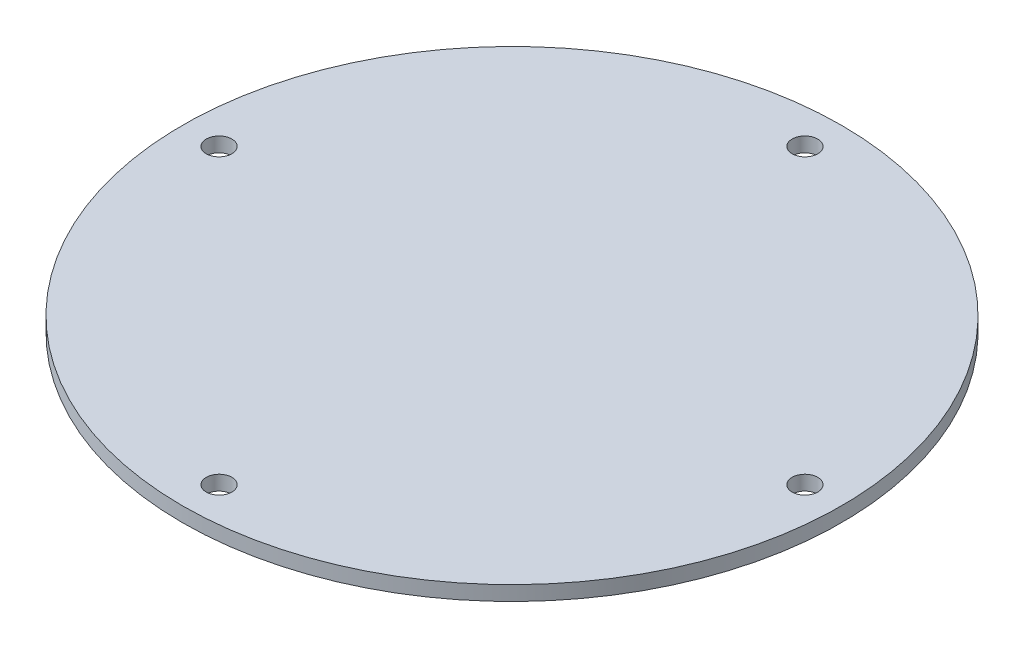
ISO-10303-21;
HEADER;
FILE_DESCRIPTION(('STEP AP214'),'2;1');
FILE_NAME('part.step','',(''),(''),'','','');
FILE_SCHEMA(('AUTOMOTIVE_DESIGN { 1 0 10303 214 1 1 1 1 }'));
ENDSEC;
DATA;
#1=APPLICATION_CONTEXT('core data for automotive mechanical design processes');
#2=APPLICATION_PROTOCOL_DEFINITION('international standard','automotive_design',2000,#1);
#3=PRODUCT_CONTEXT('',#1,'mechanical');
#4=PRODUCT('Part','Part','',(#3));
#5=PRODUCT_RELATED_PRODUCT_CATEGORY('part','',(#4));
#6=PRODUCT_DEFINITION_FORMATION('','',#4);
#7=PRODUCT_DEFINITION_CONTEXT('part definition',#1,'design');
#8=PRODUCT_DEFINITION('design','',#6,#7);
#9=PRODUCT_DEFINITION_SHAPE('','',#8);
#10=(LENGTH_UNIT() NAMED_UNIT(*) SI_UNIT(.MILLI.,.METRE.));
#11=(NAMED_UNIT(*) PLANE_ANGLE_UNIT() SI_UNIT($,.RADIAN.));
#12=(NAMED_UNIT(*) SI_UNIT($,.STERADIAN.) SOLID_ANGLE_UNIT());
#13=UNCERTAINTY_MEASURE_WITH_UNIT(LENGTH_MEASURE(1.E-05),#10,'distance_accuracy_value','');
#14=(GEOMETRIC_REPRESENTATION_CONTEXT(3) GLOBAL_UNCERTAINTY_ASSIGNED_CONTEXT((#13)) GLOBAL_UNIT_ASSIGNED_CONTEXT((#10,
#11,#12)) REPRESENTATION_CONTEXT('',''));
#15=CARTESIAN_POINT('',(0.,0.,0.));
#16=DIRECTION('',(0.,0.,1.));
#17=DIRECTION('',(1.,0.,0.));
#18=AXIS2_PLACEMENT_3D('',#15,#16,#17);
#19=CARTESIAN_POINT('',(0.,2.,0.));
#20=DIRECTION('',(0.,-1.,0.));
#21=DIRECTION('',(0.,0.,-1.));
#22=AXIS2_PLACEMENT_3D('',#19,#20,#21);
#23=CYLINDRICAL_SURFACE('',#22,45.);
#24=CARTESIAN_POINT('',(0.,2.,0.));
#25=DIRECTION('',(0.,1.,0.));
#26=DIRECTION('',(0.,0.,1.));
#27=AXIS2_PLACEMENT_3D('',#24,#25,#26);
#28=CIRCLE('',#27,45.);
#29=CARTESIAN_POINT('',(0.,2.,45.));
#30=VERTEX_POINT('',#29);
#31=EDGE_CURVE('E10',#30,#30,#28,.T.);
#32=ORIENTED_EDGE('',*,*,#31,.F.);
#33=EDGE_LOOP('',(#32));
#34=FACE_BOUND('',#33,.T.);
#35=CARTESIAN_POINT('',(0.,0.,0.));
#36=DIRECTION('',(0.,1.,0.));
#37=DIRECTION('',(0.,0.,1.));
#38=AXIS2_PLACEMENT_3D('',#35,#36,#37);
#39=CIRCLE('',#38,45.);
#40=CARTESIAN_POINT('',(0.,0.,45.));
#41=VERTEX_POINT('',#40);
#42=EDGE_CURVE('E44',#41,#41,#39,.T.);
#43=ORIENTED_EDGE('',*,*,#42,.T.);
#44=EDGE_LOOP('',(#43));
#45=FACE_BOUND('',#44,.T.);
#46=ADVANCED_FACE('F41',(#34,#45),#23,.T.);
#47=CARTESIAN_POINT('',(0.,2.,0.));
#48=DIRECTION('',(0.,1.,0.));
#49=DIRECTION('',(0.,0.,1.));
#50=AXIS2_PLACEMENT_3D('',#47,#48,#49);
#51=PLANE('',#50);
#52=CARTESIAN_POINT('',(0.,2.,-40.));
#53=DIRECTION('',(0.,1.,0.));
#54=DIRECTION('',(0.,0.,1.));
#55=AXIS2_PLACEMENT_3D('',#52,#53,#54);
#56=CIRCLE('',#55,1.75);
#57=CARTESIAN_POINT('',(0.,2.,-38.25));
#58=VERTEX_POINT('',#57);
#59=EDGE_CURVE('E71',#58,#58,#56,.T.);
#60=ORIENTED_EDGE('',*,*,#59,.F.);
#61=EDGE_LOOP('',(#60));
#62=FACE_BOUND('',#61,.T.);
#63=CARTESIAN_POINT('',(40.,2.,0.));
#64=DIRECTION('',(0.,1.,0.));
#65=DIRECTION('',(0.,0.,1.));
#66=AXIS2_PLACEMENT_3D('',#63,#64,#65);
#67=CIRCLE('',#66,1.75);
#68=CARTESIAN_POINT('',(40.,2.,1.75));
#69=VERTEX_POINT('',#68);
#70=EDGE_CURVE('E68',#69,#69,#67,.T.);
#71=ORIENTED_EDGE('',*,*,#70,.F.);
#72=EDGE_LOOP('',(#71));
#73=FACE_BOUND('',#72,.T.);
#74=CARTESIAN_POINT('',(0.,2.,40.));
#75=DIRECTION('',(0.,1.,0.));
#76=DIRECTION('',(0.,0.,1.));
#77=AXIS2_PLACEMENT_3D('',#74,#75,#76);
#78=CIRCLE('',#77,1.75);
#79=CARTESIAN_POINT('',(0.,2.,41.75));
#80=VERTEX_POINT('',#79);
#81=EDGE_CURVE('E62',#80,#80,#78,.T.);
#82=ORIENTED_EDGE('',*,*,#81,.F.);
#83=EDGE_LOOP('',(#82));
#84=FACE_BOUND('',#83,.T.);
#85=CARTESIAN_POINT('',(-40.,2.,0.));
#86=DIRECTION('',(0.,1.,0.));
#87=DIRECTION('',(0.,0.,1.));
#88=AXIS2_PLACEMENT_3D('',#85,#86,#87);
#89=CIRCLE('',#88,1.75);
#90=CARTESIAN_POINT('',(-40.,2.,1.75));
#91=VERTEX_POINT('',#90);
#92=EDGE_CURVE('E56',#91,#91,#89,.T.);
#93=ORIENTED_EDGE('',*,*,#92,.F.);
#94=EDGE_LOOP('',(#93));
#95=FACE_BOUND('',#94,.T.);
#96=ORIENTED_EDGE('',*,*,#31,.T.);
#97=EDGE_LOOP('',(#96));
#98=FACE_BOUND('',#97,.T.);
#99=ADVANCED_FACE('F87',(#62,#73,#84,#95,#98),#51,.T.);
#100=CARTESIAN_POINT('',(0.,0.,0.));
#101=DIRECTION('',(0.,1.,0.));
#102=DIRECTION('',(0.,0.,1.));
#103=AXIS2_PLACEMENT_3D('',#100,#101,#102);
#104=PLANE('',#103);
#105=CARTESIAN_POINT('',(0.,0.,-40.));
#106=DIRECTION('',(0.,1.,0.));
#107=DIRECTION('',(0.,0.,1.));
#108=AXIS2_PLACEMENT_3D('',#105,#106,#107);
#109=CIRCLE('',#108,1.75);
#110=CARTESIAN_POINT('',(0.,0.,-38.25));
#111=VERTEX_POINT('',#110);
#112=EDGE_CURVE('E51',#111,#111,#109,.T.);
#113=ORIENTED_EDGE('',*,*,#112,.T.);
#114=EDGE_LOOP('',(#113));
#115=FACE_BOUND('',#114,.T.);
#116=CARTESIAN_POINT('',(40.,0.,0.));
#117=DIRECTION('',(0.,1.,0.));
#118=DIRECTION('',(0.,0.,1.));
#119=AXIS2_PLACEMENT_3D('',#116,#117,#118);
#120=CIRCLE('',#119,1.75);
#121=CARTESIAN_POINT('',(40.,0.,1.75));
#122=VERTEX_POINT('',#121);
#123=EDGE_CURVE('E65',#122,#122,#120,.T.);
#124=ORIENTED_EDGE('',*,*,#123,.T.);
#125=EDGE_LOOP('',(#124));
#126=FACE_BOUND('',#125,.T.);
#127=CARTESIAN_POINT('',(0.,0.,40.));
#128=DIRECTION('',(0.,1.,0.));
#129=DIRECTION('',(0.,0.,1.));
#130=AXIS2_PLACEMENT_3D('',#127,#128,#129);
#131=CIRCLE('',#130,1.75);
#132=CARTESIAN_POINT('',(0.,0.,41.75));
#133=VERTEX_POINT('',#132);
#134=EDGE_CURVE('E59',#133,#133,#131,.T.);
#135=ORIENTED_EDGE('',*,*,#134,.T.);
#136=EDGE_LOOP('',(#135));
#137=FACE_BOUND('',#136,.T.);
#138=CARTESIAN_POINT('',(-40.,0.,0.));
#139=DIRECTION('',(0.,1.,0.));
#140=DIRECTION('',(0.,0.,1.));
#141=AXIS2_PLACEMENT_3D('',#138,#139,#140);
#142=CIRCLE('',#141,1.75);
#143=CARTESIAN_POINT('',(-40.,0.,1.75));
#144=VERTEX_POINT('',#143);
#145=EDGE_CURVE('E53',#144,#144,#142,.T.);
#146=ORIENTED_EDGE('',*,*,#145,.T.);
#147=EDGE_LOOP('',(#146));
#148=FACE_BOUND('',#147,.T.);
#149=ORIENTED_EDGE('',*,*,#42,.F.);
#150=EDGE_LOOP('',(#149));
#151=FACE_BOUND('',#150,.T.);
#152=ADVANCED_FACE('F77',(#115,#126,#137,#148,#151),#104,.F.);
#153=CARTESIAN_POINT('',(-40.,0.,0.));
#154=DIRECTION('',(0.,1.,0.));
#155=DIRECTION('',(0.,0.,1.));
#156=AXIS2_PLACEMENT_3D('',#153,#154,#155);
#157=CYLINDRICAL_SURFACE('',#156,1.75);
#158=ORIENTED_EDGE('',*,*,#145,.F.);
#159=EDGE_LOOP('',(#158));
#160=FACE_BOUND('',#159,.T.);
#161=ORIENTED_EDGE('',*,*,#92,.T.);
#162=EDGE_LOOP('',(#161));
#163=FACE_BOUND('',#162,.T.);
#164=ADVANCED_FACE('F97',(#160,#163),#157,.F.);
#165=CARTESIAN_POINT('',(0.,0.,40.));
#166=DIRECTION('',(0.,1.,0.));
#167=DIRECTION('',(0.,0.,1.));
#168=AXIS2_PLACEMENT_3D('',#165,#166,#167);
#169=CYLINDRICAL_SURFACE('',#168,1.75);
#170=ORIENTED_EDGE('',*,*,#134,.F.);
#171=EDGE_LOOP('',(#170));
#172=FACE_BOUND('',#171,.T.);
#173=ORIENTED_EDGE('',*,*,#81,.T.);
#174=EDGE_LOOP('',(#173));
#175=FACE_BOUND('',#174,.T.);
#176=ADVANCED_FACE('F99',(#172,#175),#169,.F.);
#177=CARTESIAN_POINT('',(40.,0.,0.));
#178=DIRECTION('',(0.,1.,0.));
#179=DIRECTION('',(0.,0.,1.));
#180=AXIS2_PLACEMENT_3D('',#177,#178,#179);
#181=CYLINDRICAL_SURFACE('',#180,1.75);
#182=ORIENTED_EDGE('',*,*,#123,.F.);
#183=EDGE_LOOP('',(#182));
#184=FACE_BOUND('',#183,.T.);
#185=ORIENTED_EDGE('',*,*,#70,.T.);
#186=EDGE_LOOP('',(#185));
#187=FACE_BOUND('',#186,.T.);
#188=ADVANCED_FACE('F83',(#184,#187),#181,.F.);
#189=CARTESIAN_POINT('',(0.,0.,-40.));
#190=DIRECTION('',(0.,1.,0.));
#191=DIRECTION('',(0.,0.,1.));
#192=AXIS2_PLACEMENT_3D('',#189,#190,#191);
#193=CYLINDRICAL_SURFACE('',#192,1.75);
#194=ORIENTED_EDGE('',*,*,#112,.F.);
#195=EDGE_LOOP('',(#194));
#196=FACE_BOUND('',#195,.T.);
#197=ORIENTED_EDGE('',*,*,#59,.T.);
#198=EDGE_LOOP('',(#197));
#199=FACE_BOUND('',#198,.T.);
#200=ADVANCED_FACE('F80',(#196,#199),#193,.F.);
#201=CLOSED_SHELL('',(#46,#99,#152,#164,#176,#188,#200));
#202=MANIFOLD_SOLID_BREP('B2',#201);
#203=ADVANCED_BREP_SHAPE_REPRESENTATION('',(#18,#202),#14);
#204=SHAPE_DEFINITION_REPRESENTATION(#9,#203);
ENDSEC;
END-ISO-10303-21;
